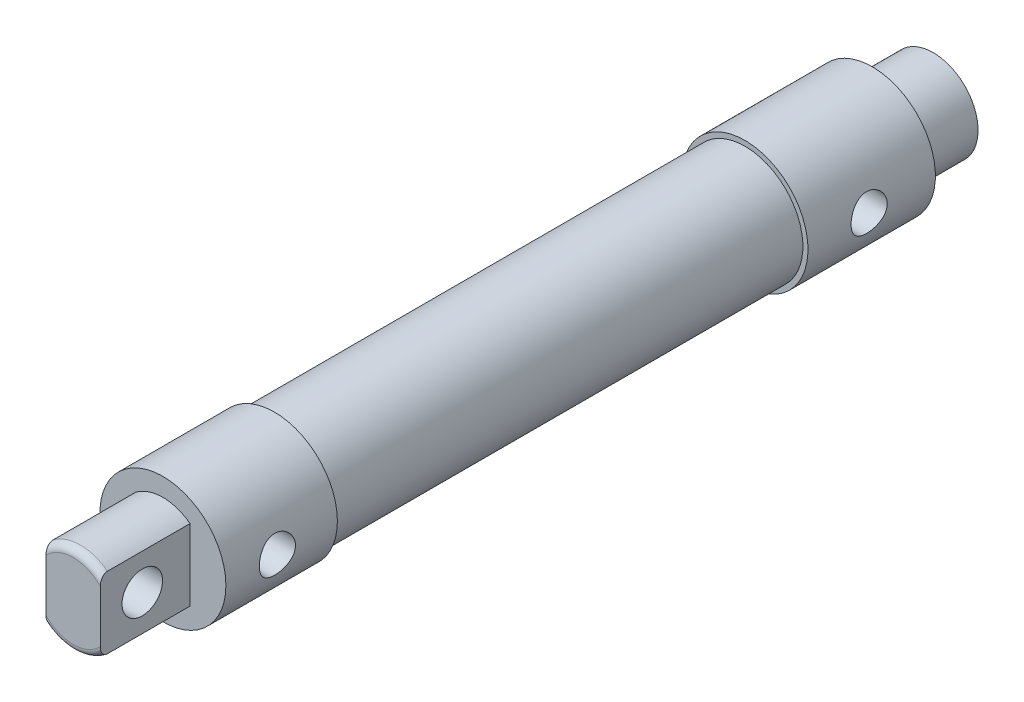
ISO-10303-21;
HEADER;
FILE_DESCRIPTION(('STEP AP214'),'2;1');
FILE_NAME('part.step','',(''),(''),'','','');
FILE_SCHEMA(('AUTOMOTIVE_DESIGN { 1 0 10303 214 1 1 1 1 }'));
ENDSEC;
DATA;
#1=APPLICATION_CONTEXT('core data for automotive mechanical design processes');
#2=APPLICATION_PROTOCOL_DEFINITION('international standard','automotive_design',2000,#1);
#3=PRODUCT_CONTEXT('',#1,'mechanical');
#4=PRODUCT('Part','Part','',(#3));
#5=PRODUCT_RELATED_PRODUCT_CATEGORY('part','',(#4));
#6=PRODUCT_DEFINITION_FORMATION('','',#4);
#7=PRODUCT_DEFINITION_CONTEXT('part definition',#1,'design');
#8=PRODUCT_DEFINITION('design','',#6,#7);
#9=PRODUCT_DEFINITION_SHAPE('','',#8);
#10=(LENGTH_UNIT() NAMED_UNIT(*) SI_UNIT(.MILLI.,.METRE.));
#11=(NAMED_UNIT(*) PLANE_ANGLE_UNIT() SI_UNIT($,.RADIAN.));
#12=(NAMED_UNIT(*) SI_UNIT($,.STERADIAN.) SOLID_ANGLE_UNIT());
#13=UNCERTAINTY_MEASURE_WITH_UNIT(LENGTH_MEASURE(1.E-05),#10,'distance_accuracy_value','');
#14=(GEOMETRIC_REPRESENTATION_CONTEXT(3) GLOBAL_UNCERTAINTY_ASSIGNED_CONTEXT((#13)) GLOBAL_UNIT_ASSIGNED_CONTEXT((#10,
#11,#12)) REPRESENTATION_CONTEXT('',''));
#15=CARTESIAN_POINT('',(0.,0.,0.));
#16=DIRECTION('',(0.,0.,1.));
#17=DIRECTION('',(1.,0.,0.));
#18=AXIS2_PLACEMENT_3D('',#15,#16,#17);
#19=CARTESIAN_POINT('',(0.,0.,102.108));
#20=DIRECTION('',(0.,0.,-1.));
#21=DIRECTION('',(-1.,0.,0.));
#22=AXIS2_PLACEMENT_3D('',#19,#20,#21);
#23=CYLINDRICAL_SURFACE('',#22,11.049);
#24=CARTESIAN_POINT('',(0.,0.,102.108));
#25=DIRECTION('',(0.,0.,1.));
#26=DIRECTION('',(1.,0.,0.));
#27=AXIS2_PLACEMENT_3D('',#24,#25,#26);
#28=CIRCLE('',#27,11.049);
#29=CARTESIAN_POINT('',(11.049,0.,102.108));
#30=VERTEX_POINT('',#29);
#31=EDGE_CURVE('E215',#30,#30,#28,.T.);
#32=ORIENTED_EDGE('',*,*,#31,.F.);
#33=EDGE_LOOP('',(#32));
#34=FACE_BOUND('',#33,.T.);
#35=CARTESIAN_POINT('',(0.,0.,82.55));
#36=DIRECTION('',(0.,0.,1.));
#37=DIRECTION('',(1.,0.,0.));
#38=AXIS2_PLACEMENT_3D('',#35,#36,#37);
#39=CIRCLE('',#38,11.049);
#40=CARTESIAN_POINT('',(11.049,0.,82.55));
#41=VERTEX_POINT('',#40);
#42=EDGE_CURVE('E216',#41,#41,#39,.T.);
#43=ORIENTED_EDGE('',*,*,#42,.T.);
#44=EDGE_LOOP('',(#43));
#45=FACE_BOUND('',#44,.T.);
#46=CARTESIAN_POINT('',(10.5829946612478,-3.175,93.0760778464226));
#47=CARTESIAN_POINT('',(10.5829970378921,-3.17499696173694,93.2504210160346));
#48=CARTESIAN_POINT('',(10.5873499628536,-3.16059101598809,93.4247947914254));
#49=CARTESIAN_POINT('',(10.6042287733974,-3.10348071440142,93.7684686648293));
#50=CARTESIAN_POINT('',(10.6167579154399,-3.06076508315063,93.9377667131465));
#51=CARTESIAN_POINT('',(10.6484555361327,-2.94858604276688,94.266265950174));
#52=CARTESIAN_POINT('',(10.6676136440502,-2.87916439519901,94.4254824534469));
#53=CARTESIAN_POINT('',(10.7103968556723,-2.71567886194747,94.7300428356047));
#54=CARTESIAN_POINT('',(10.7340225055439,-2.62161196278527,94.8753850150505));
#55=CARTESIAN_POINT('',(10.7838478929209,-2.40858326173655,95.1522908243156));
#56=CARTESIAN_POINT('',(10.8100989589948,-2.28903221307923,95.2833920018629));
#57=CARTESIAN_POINT('',(10.8617771284488,-2.02969339145336,95.5239875474528));
#58=CARTESIAN_POINT('',(10.8872041340175,-1.88990322690515,95.63347935838));
#59=CARTESIAN_POINT('',(10.9349482869144,-1.59079703436564,95.8297248552312));
#60=CARTESIAN_POINT('',(10.9571978703645,-1.43116293599986,95.9160116284078));
#61=CARTESIAN_POINT('',(10.9954868205641,-1.09890403668004,96.0603402425021));
#62=CARTESIAN_POINT('',(11.0115274108589,-0.926281803186664,96.1183876488545));
#63=CARTESIAN_POINT('',(11.0352279538983,-0.577780737066135,96.2030726139401));
#64=CARTESIAN_POINT('',(11.0430978601515,-0.402107999548981,96.2304985007207));
#65=CARTESIAN_POINT('',(11.0503076095615,-0.0484902253797742,96.2556497122282));
#66=CARTESIAN_POINT('',(11.0496491013871,0.129454365444954,96.2533807774033));
#67=CARTESIAN_POINT('',(11.0400267625263,0.477051272742408,96.2197461231162));
#68=CARTESIAN_POINT('',(11.0313063870296,0.646793905386179,96.1892332895884));
#69=CARTESIAN_POINT('',(11.0068326238017,0.978639250638321,96.1013641482073));
#70=CARTESIAN_POINT('',(10.991078806017,1.14074149541176,96.0440061989228));
#71=CARTESIAN_POINT('',(10.9539621303433,1.4547904040677,95.9034681087909));
#72=CARTESIAN_POINT('',(10.9325393858836,1.60660549873712,95.8200104285103));
#73=CARTESIAN_POINT('',(10.8863714985496,1.89435605989024,95.6298587495398));
#74=CARTESIAN_POINT('',(10.8616256211488,2.03028800319434,95.5231596104371));
#75=CARTESIAN_POINT('',(10.8104367437012,2.28750533131605,95.2850886155363));
#76=CARTESIAN_POINT('',(10.7839646808932,2.4080998224991,95.1529756044689));
#77=CARTESIAN_POINT('',(10.733084389821,2.62560689303648,94.8701356166965));
#78=CARTESIAN_POINT('',(10.7086763331534,2.72251750463204,94.7194070948998));
#79=CARTESIAN_POINT('',(10.6645569111701,2.89054812362863,94.4019229266747));
#80=CARTESIAN_POINT('',(10.6448854814472,2.96145130546496,94.2350465742272));
#81=CARTESIAN_POINT('',(10.6129476152519,3.07395555813914,93.8910300905357));
#82=CARTESIAN_POINT('',(10.6006789953196,3.11556526969433,93.7138930026082));
#83=CARTESIAN_POINT('',(10.585409663935,3.16704977828252,93.360914762678));
#84=CARTESIAN_POINT('',(10.5821046142205,3.17796715559108,93.185238699667));
#85=CARTESIAN_POINT('',(10.5842985066283,3.17065339734403,92.8345648988625));
#86=CARTESIAN_POINT('',(10.5897963357224,3.15242594683497,92.659567078117));
#87=CARTESIAN_POINT('',(10.6086796202177,3.08826497319619,92.3194335876821));
#88=CARTESIAN_POINT('',(10.6218788212302,3.04298510170739,92.1541632424752));
#89=CARTESIAN_POINT('',(10.654488955992,2.92675343849825,91.8335706419406));
#90=CARTESIAN_POINT('',(10.6739007932801,2.85579791242604,91.6782498375766));
#91=CARTESIAN_POINT('',(10.7173525725105,2.68819763195385,91.3776772532887));
#92=CARTESIAN_POINT('',(10.7414960228918,2.59095536802797,91.2327739732972));
#93=CARTESIAN_POINT('',(10.7914602367789,2.37426353068632,90.9609601536623));
#94=CARTESIAN_POINT('',(10.8172813672868,2.25480908751678,90.8340535703535));
#95=CARTESIAN_POINT('',(10.8687608358398,1.99221286364236,90.5973670912839));
#96=CARTESIAN_POINT('',(10.8943833784092,1.84840048120929,90.4883217183711));
#97=CARTESIAN_POINT('',(10.9416824947104,1.54391896032718,90.2959043170114));
#98=CARTESIAN_POINT('',(10.963359273833,1.38325069997259,90.2125309520897));
#99=CARTESIAN_POINT('',(11.0001869824692,1.05072587538093,90.0746217473224));
#100=CARTESIAN_POINT('',(11.0153871097535,0.8789655035982,90.0198677607017));
#101=CARTESIAN_POINT('',(11.0377661850788,0.528171227762893,89.9401585545153));
#102=CARTESIAN_POINT('',(11.0449472223555,0.349139230810347,89.9151955732998));
#103=CARTESIAN_POINT('',(11.0503629040812,-0.00430043148248762,89.8963271602359));
#104=CARTESIAN_POINT('',(11.0489056996126,-0.178647014664036,89.9013520194536));
#105=CARTESIAN_POINT('',(11.0379233962819,-0.523908669717691,89.9397882629655));
#106=CARTESIAN_POINT('',(11.0283986915624,-0.69482390881254,89.9731982604872));
#107=CARTESIAN_POINT('',(11.0024294098578,-1.0268668171994,90.0668151441214));
#108=CARTESIAN_POINT('',(10.9860488399852,-1.18806963267255,90.1267744555124));
#109=CARTESIAN_POINT('',(10.9480678507565,-1.49821572280081,90.2715676330534));
#110=CARTESIAN_POINT('',(10.9264666173167,-1.64715708060556,90.3564053790612));
#111=CARTESIAN_POINT('',(10.8795235460163,-1.93340384841198,90.5515049284692));
#112=CARTESIAN_POINT('',(10.8540889319086,-2.07022613928248,90.6624530931705));
#113=CARTESIAN_POINT('',(10.8026716112853,-2.32367039959812,90.9053626023441));
#114=CARTESIAN_POINT('',(10.7766887543745,-2.44028674310765,91.0373297795669));
#115=CARTESIAN_POINT('',(10.7263080053237,-2.65311527076294,91.3227581932267));
#116=CARTESIAN_POINT('',(10.7019708346248,-2.7487006048838,91.4766986591247));
#117=CARTESIAN_POINT('',(10.6585601925368,-2.91251111919759,91.7991430987811));
#118=CARTESIAN_POINT('',(10.6394838228281,-2.98075137397164,91.9676389860896));
#119=CARTESIAN_POINT('',(10.6109457090473,-3.08067604297106,92.2918605638783));
#120=CARTESIAN_POINT('',(10.6005573203454,-3.11595595609863,92.4464045642196));
#121=CARTESIAN_POINT('',(10.5865812685406,-3.16311741659185,92.7593169877032));
#122=CARTESIAN_POINT('',(10.5829925020353,-3.17500276030191,92.9176847861173));
#123=CARTESIAN_POINT('',(10.5829946612478,-3.175,93.0760778464226));
#124=B_SPLINE_CURVE_WITH_KNOTS('',3,(#46,#47,#48,#49,#50,#51,#52,#53,#54,#55,#56,#57,#58,#59,
#60,#61,#62,#63,#64,#65,#66,#67,#68,#69,#70,#71,#72,#73,#74,#75,#76,#77,#78,#79,#80,#81,#82,#83,
#84,#85,#86,#87,#88,#89,#90,#91,#92,#93,#94,#95,#96,#97,#98,#99,#100,#101,#102,#103,#104,#105,
#106,#107,#108,#109,#110,#111,#112,#113,#114,#115,#116,#117,#118,#119,#120,#121,#122,#123),
.UNSPECIFIED.,.T.,.F.,(4,2,2,2,2,2,2,2,2,2,2,2,2,2,2,2,2,2,2,2,2,2,2,2,2,2,2,2,2,2,2,2,2,2,2,2,
2,2,4),(0.,0.522445971515646,1.04510015223567,1.56694033248867,2.08884435013764,
2.62446334981218,3.16014569329022,3.70591356848465,4.25157383973313,4.78283705764741,
5.31399757604563,5.82962412489643,6.34528220559616,6.86662167203276,7.38807656264306,
7.92803521591125,8.46803871603087,9.01244709372958,9.55669481951292,10.0822178130475,
10.6076743651684,11.1209208176782,11.6342419484683,12.1603874377864,12.6866484144843,
13.230914757694,13.7751527618185,14.3151795683734,14.8550656473995,15.375811108637,
15.8965311300157,16.4124944283516,16.9285382353606,17.4600631929064,17.9917359057943,
18.5375828018549,19.0831283723763,19.5578544443061,20.0325034738991),.UNSPECIFIED.);
#125=CARTESIAN_POINT('',(10.5829946612478,-3.175,93.0760778464226));
#126=VERTEX_POINT('',#125);
#127=EDGE_CURVE('E119',#126,#126,#124,.T.);
#128=ORIENTED_EDGE('',*,*,#127,.T.);
#129=EDGE_LOOP('',(#128));
#130=FACE_BOUND('',#129,.T.);
#131=ADVANCED_FACE('F46',(#34,#45,#130),#23,.T.);
#132=CARTESIAN_POINT('',(0.,0.,91.948));
#133=DIRECTION('',(0.,0.,-1.));
#134=DIRECTION('',(-1.,0.,0.));
#135=AXIS2_PLACEMENT_3D('',#132,#133,#134);
#136=CYLINDRICAL_SURFACE('',#135,3.175);
#137=CARTESIAN_POINT('',(0.,0.,82.55));
#138=DIRECTION('',(0.,0.,1.));
#139=DIRECTION('',(1.,0.,0.));
#140=AXIS2_PLACEMENT_3D('',#137,#138,#139);
#141=CIRCLE('',#140,3.175);
#142=CARTESIAN_POINT('',(3.175,0.,82.55));
#143=VERTEX_POINT('',#142);
#144=EDGE_CURVE('E51',#143,#143,#141,.T.);
#145=ORIENTED_EDGE('',*,*,#144,.F.);
#146=EDGE_LOOP('',(#145));
#147=FACE_BOUND('',#146,.T.);
#148=CARTESIAN_POINT('',(0.,0.,93.0760778464226));
#149=DIRECTION('',(-0.707106781186548,0.,-0.707106781186547));
#150=DIRECTION('',(-0.707106781186548,0.,0.707106781186547));
#151=AXIS2_PLACEMENT_3D('',#148,#149,#150);
#152=ELLIPSE('',#151,4.49012806053458,3.175);
#153=CARTESIAN_POINT('',(1.12807784642254,-2.96783850174006,91.948));
#154=VERTEX_POINT('',#153);
#155=CARTESIAN_POINT('',(1.12807784642255,2.96783850174005,91.948));
#156=VERTEX_POINT('',#155);
#157=EDGE_CURVE('E123',#154,#156,#152,.F.);
#158=ORIENTED_EDGE('',*,*,#157,.T.);
#159=CARTESIAN_POINT('',(0.,0.,91.948));
#160=DIRECTION('',(0.,0.,-1.));
#161=DIRECTION('',(-1.,0.,0.));
#162=AXIS2_PLACEMENT_3D('',#159,#160,#161);
#163=CIRCLE('',#162,3.175);
#164=EDGE_CURVE('E128',#154,#156,#163,.T.);
#165=ORIENTED_EDGE('',*,*,#164,.F.);
#166=EDGE_LOOP('',(#158,#165));
#167=FACE_BOUND('',#166,.T.);
#168=ADVANCED_FACE('F149',(#147,#167),#136,.F.);
#169=CARTESIAN_POINT('',(0.,0.,91.948));
#170=DIRECTION('',(0.,0.,-1.));
#171=DIRECTION('',(-1.,0.,0.));
#172=AXIS2_PLACEMENT_3D('',#169,#170,#171);
#173=PLANE('',#172);
#174=DIRECTION('',(0.,1.,0.));
#175=VECTOR('',#174,1.);
#176=CARTESIAN_POINT('',(0.,0.,91.948));
#177=LINE('',#176,#175);
#178=CARTESIAN_POINT('',(0.,-2.96783850174005,91.948));
#179=VERTEX_POINT('',#178);
#180=CARTESIAN_POINT('',(0.,2.96783850174005,91.948));
#181=VERTEX_POINT('',#180);
#182=EDGE_CURVE('E118',#179,#181,#177,.T.);
#183=ORIENTED_EDGE('',*,*,#182,.F.);
#184=DIRECTION('',(-1.,0.,0.));
#185=VECTOR('',#184,1.);
#186=CARTESIAN_POINT('',(11.05,-2.96783850174005,91.948));
#187=LINE('',#186,#185);
#188=EDGE_CURVE('E63',#154,#179,#187,.T.);
#189=ORIENTED_EDGE('',*,*,#188,.F.);
#190=ORIENTED_EDGE('',*,*,#164,.T.);
#191=DIRECTION('',(-1.,0.,0.));
#192=VECTOR('',#191,1.);
#193=CARTESIAN_POINT('',(11.05,2.96783850174006,91.948));
#194=LINE('',#193,#192);
#195=EDGE_CURVE('E114',#181,#156,#194,.F.);
#196=ORIENTED_EDGE('',*,*,#195,.F.);
#197=EDGE_LOOP('',(#183,#189,#190,#196));
#198=FACE_BOUND('',#197,.T.);
#199=ADVANCED_FACE('F126',(#198),#173,.T.);
#200=CARTESIAN_POINT('',(0.,0.,102.108));
#201=DIRECTION('',(0.,0.,1.));
#202=DIRECTION('',(1.,0.,0.));
#203=AXIS2_PLACEMENT_3D('',#200,#201,#202);
#204=PLANE('',#203);
#205=ORIENTED_EDGE('',*,*,#31,.T.);
#206=EDGE_LOOP('',(#205));
#207=FACE_BOUND('',#206,.T.);
#208=DIRECTION('',(0.,-1.,0.));
#209=VECTOR('',#208,1.);
#210=CARTESIAN_POINT('',(-4.7625,-6.27044414296148,102.108));
#211=LINE('',#210,#209);
#212=CARTESIAN_POINT('',(-4.7625,6.27044414296148,102.108));
#213=VERTEX_POINT('',#212);
#214=CARTESIAN_POINT('',(-4.7625,-6.27044414296148,102.108));
#215=VERTEX_POINT('',#214);
#216=EDGE_CURVE('E237',#213,#215,#211,.T.);
#217=ORIENTED_EDGE('',*,*,#216,.F.);
#218=CARTESIAN_POINT('',(0.,0.,102.108));
#219=DIRECTION('',(0.,0.,1.));
#220=DIRECTION('',(1.,0.,0.));
#221=AXIS2_PLACEMENT_3D('',#218,#219,#220);
#222=CIRCLE('',#221,7.874);
#223=CARTESIAN_POINT('',(4.7625,6.27044414296148,102.108));
#224=VERTEX_POINT('',#223);
#225=EDGE_CURVE('E240',#224,#213,#222,.T.);
#226=ORIENTED_EDGE('',*,*,#225,.F.);
#227=DIRECTION('',(0.,1.,0.));
#228=VECTOR('',#227,1.);
#229=CARTESIAN_POINT('',(4.7625,-6.27044414296148,102.108));
#230=LINE('',#229,#228);
#231=CARTESIAN_POINT('',(4.7625,-6.27044414296148,102.108));
#232=VERTEX_POINT('',#231);
#233=EDGE_CURVE('E230',#232,#224,#230,.T.);
#234=ORIENTED_EDGE('',*,*,#233,.F.);
#235=CARTESIAN_POINT('',(0.,0.,102.108));
#236=DIRECTION('',(0.,0.,1.));
#237=DIRECTION('',(1.,0.,0.));
#238=AXIS2_PLACEMENT_3D('',#235,#236,#237);
#239=CIRCLE('',#238,7.874);
#240=EDGE_CURVE('E234',#215,#232,#239,.T.);
#241=ORIENTED_EDGE('',*,*,#240,.F.);
#242=EDGE_LOOP('',(#217,#226,#234,#241));
#243=FACE_BOUND('',#242,.T.);
#244=ADVANCED_FACE('F259',(#207,#243),#204,.T.);
#245=CARTESIAN_POINT('',(0.,0.,82.55));
#246=DIRECTION('',(0.,0.,1.));
#247=DIRECTION('',(1.,0.,0.));
#248=AXIS2_PLACEMENT_3D('',#245,#246,#247);
#249=PLANE('',#248);
#250=ORIENTED_EDGE('',*,*,#144,.T.);
#251=EDGE_LOOP('',(#250));
#252=FACE_BOUND('',#251,.T.);
#253=ORIENTED_EDGE('',*,*,#42,.F.);
#254=EDGE_LOOP('',(#253));
#255=FACE_BOUND('',#254,.T.);
#256=ADVANCED_FACE('F160',(#252,#255),#249,.F.);
#257=CARTESIAN_POINT('',(0.,0.,117.856));
#258=DIRECTION('',(0.,0.,-1.));
#259=DIRECTION('',(-1.,0.,0.));
#260=AXIS2_PLACEMENT_3D('',#257,#258,#259);
#261=CYLINDRICAL_SURFACE('',#260,7.874);
#262=DIRECTION('',(0.,0.,-1.));
#263=VECTOR('',#262,1.);
#264=CARTESIAN_POINT('',(-4.7625,6.27044414296148,117.856));
#265=LINE('',#264,#263);
#266=CARTESIAN_POINT('',(-4.7625,6.27044414296148,116.586));
#267=VERTEX_POINT('',#266);
#268=EDGE_CURVE('E219',#267,#213,#265,.T.);
#269=ORIENTED_EDGE('',*,*,#268,.F.);
#270=CARTESIAN_POINT('',(0.,0.,116.586));
#271=DIRECTION('',(0.,0.,1.));
#272=DIRECTION('',(1.,0.,0.));
#273=AXIS2_PLACEMENT_3D('',#270,#271,#272);
#274=CIRCLE('',#273,7.874);
#275=CARTESIAN_POINT('',(4.7625,6.27044414296148,116.586));
#276=VERTEX_POINT('',#275);
#277=EDGE_CURVE('E284',#267,#276,#274,.F.);
#278=ORIENTED_EDGE('',*,*,#277,.T.);
#279=DIRECTION('',(0.,0.,-1.));
#280=VECTOR('',#279,1.);
#281=CARTESIAN_POINT('',(4.7625,6.27044414296148,117.856));
#282=LINE('',#281,#280);
#283=EDGE_CURVE('E227',#276,#224,#282,.T.);
#284=ORIENTED_EDGE('',*,*,#283,.T.);
#285=ORIENTED_EDGE('',*,*,#225,.T.);
#286=EDGE_LOOP('',(#269,#278,#284,#285));
#287=FACE_BOUND('',#286,.T.);
#288=ADVANCED_FACE('F201',(#287),#261,.T.);
#289=CARTESIAN_POINT('',(-4.7625,-6.27044414296148,117.856));
#290=DIRECTION('',(1.,0.,0.));
#291=DIRECTION('',(0.,1.,0.));
#292=AXIS2_PLACEMENT_3D('',#289,#290,#291);
#293=PLANE('',#292);
#294=CARTESIAN_POINT('',(-4.7625,0.,110.49));
#295=DIRECTION('',(1.,0.,0.));
#296=DIRECTION('',(0.,1.,0.));
#297=AXIS2_PLACEMENT_3D('',#294,#295,#296);
#298=CIRCLE('',#297,3.556);
#299=CARTESIAN_POINT('',(-4.7625,3.556,110.49));
#300=VERTEX_POINT('',#299);
#301=EDGE_CURVE('E243',#300,#300,#298,.F.);
#302=ORIENTED_EDGE('',*,*,#301,.F.);
#303=EDGE_LOOP('',(#302));
#304=FACE_BOUND('',#303,.T.);
#305=DIRECTION('',(0.,-1.,0.));
#306=VECTOR('',#305,1.);
#307=CARTESIAN_POINT('',(-4.7625,-6.27044414296148,117.856));
#308=LINE('',#307,#306);
#309=CARTESIAN_POINT('',(-4.7625,4.57508576422344,117.856));
#310=VERTEX_POINT('',#309);
#311=CARTESIAN_POINT('',(-4.7625,-4.57508576422344,117.856));
#312=VERTEX_POINT('',#311);
#313=EDGE_CURVE('E233',#310,#312,#308,.T.);
#314=ORIENTED_EDGE('',*,*,#313,.F.);
#315=CARTESIAN_POINT('',(-4.7625,4.57508576422344,117.856));
#316=CARTESIAN_POINT('',(-4.7625,4.70491371485058,117.855988992306));
#317=CARTESIAN_POINT('',(-4.7625,4.83558278945041,117.84641170347));
#318=CARTESIAN_POINT('',(-4.7625,5.09465420787404,117.804901270244));
#319=CARTESIAN_POINT('',(-4.7625,5.22301707247969,117.772728857364));
#320=CARTESIAN_POINT('',(-4.7625,5.42870338399686,117.697882839221));
#321=CARTESIAN_POINT('',(-4.7625,5.50862070615666,117.662427605347));
#322=CARTESIAN_POINT('',(-4.7625,5.66172310725953,117.579556838602));
#323=CARTESIAN_POINT('',(-4.7625,5.73493413756744,117.532190319702));
#324=CARTESIAN_POINT('',(-4.7625,5.85954621136902,117.43471115017));
#325=CARTESIAN_POINT('',(-4.7625,5.91250696068593,117.386601100032));
#326=CARTESIAN_POINT('',(-4.7625,6.00991201638405,117.282266864641));
#327=CARTESIAN_POINT('',(-4.7625,6.05435186214026,117.226038456345));
#328=CARTESIAN_POINT('',(-4.7625,6.13268330527644,117.105874884677));
#329=CARTESIAN_POINT('',(-4.7625,6.16647767328858,117.041875685665));
#330=CARTESIAN_POINT('',(-4.7625,6.22061826265151,116.908469254315));
#331=CARTESIAN_POINT('',(-4.7625,6.24099787353804,116.839075933595));
#332=CARTESIAN_POINT('',(-4.7625,6.25939312554719,116.738328586812));
#333=CARTESIAN_POINT('',(-4.7625,6.26353112778692,116.708002020549));
#334=CARTESIAN_POINT('',(-4.7625,6.26905575751436,116.647123988509));
#335=CARTESIAN_POINT('',(-4.7625,6.27044458262064,116.616572721978));
#336=CARTESIAN_POINT('',(-4.7625,6.27044414296148,116.586));
#337=B_SPLINE_CURVE_WITH_KNOTS('',3,(#315,#316,#317,#318,#319,#320,#321,#322,#323,#324,#325,
#326,#327,#328,#329,#330,#331,#332,#333,#334,#335,#336),.UNSPECIFIED.,.F.,.F.,(4,2,2,2,2,2,2,2,
2,2,4),(0.,0.39051208259768,0.785223048386074,1.04660172879821,1.30692197058371,
1.52073252531684,1.7346547043959,1.95047758121078,2.16576121964784,2.25747938820261,
2.34912421005433),.UNSPECIFIED.);
#338=EDGE_CURVE('E169',#310,#267,#337,.T.);
#339=ORIENTED_EDGE('',*,*,#338,.T.);
#340=ORIENTED_EDGE('',*,*,#268,.T.);
#341=ORIENTED_EDGE('',*,*,#216,.T.);
#342=DIRECTION('',(0.,0.,-1.));
#343=VECTOR('',#342,1.);
#344=CARTESIAN_POINT('',(-4.7625,-6.27044414296148,117.856));
#345=LINE('',#344,#343);
#346=CARTESIAN_POINT('',(-4.7625,-6.27044414296148,116.586));
#347=VERTEX_POINT('',#346);
#348=EDGE_CURVE('E223',#347,#215,#345,.T.);
#349=ORIENTED_EDGE('',*,*,#348,.F.);
#350=CARTESIAN_POINT('',(-4.7625,-6.27044414296148,116.586));
#351=CARTESIAN_POINT('',(-4.7625,-6.27044695744104,116.616318737493));
#352=CARTESIAN_POINT('',(-4.7625,-6.26907969386893,116.646620938918));
#353=CARTESIAN_POINT('',(-4.7625,-6.26364600379126,116.706969671006));
#354=CARTESIAN_POINT('',(-4.7625,-6.25958072650013,116.737016305011));
#355=CARTESIAN_POINT('',(-4.7625,-6.24346537985301,116.826103039148));
#356=CARTESIAN_POINT('',(-4.7625,-6.22749460557059,116.884476323768));
#357=CARTESIAN_POINT('',(-4.7625,-6.18599695256506,116.997565139999));
#358=CARTESIAN_POINT('',(-4.7625,-6.16048225576697,117.052285230088));
#359=CARTESIAN_POINT('',(-4.7625,-6.10112984915438,117.15705512157));
#360=CARTESIAN_POINT('',(-4.7625,-6.06728241065118,117.207099368899));
#361=CARTESIAN_POINT('',(-4.7625,-5.99039711728846,117.304581778947));
#362=CARTESIAN_POINT('',(-4.7625,-5.9469247650016,117.351675051199));
#363=CARTESIAN_POINT('',(-4.7625,-5.85384044814121,117.439249704828));
#364=CARTESIAN_POINT('',(-4.7625,-5.80422853679333,117.479731143517));
#365=CARTESIAN_POINT('',(-4.7625,-5.67534049300729,117.571859726782));
#366=CARTESIAN_POINT('',(-4.7625,-5.59323792773678,117.619567571663));
#367=CARTESIAN_POINT('',(-4.7625,-5.42216260650941,117.701174178103));
#368=CARTESIAN_POINT('',(-4.7625,-5.33316043671504,117.735009459685));
#369=CARTESIAN_POINT('',(-4.7625,-5.13378043928996,117.795050891071));
#370=CARTESIAN_POINT('',(-4.7625,-5.02259523817668,117.81851969187));
#371=CARTESIAN_POINT('',(-4.7625,-4.79915137908822,117.848894386153));
#372=CARTESIAN_POINT('',(-4.7625,-4.68691720505675,117.855976060827));
#373=CARTESIAN_POINT('',(-4.7625,-4.57508576422344,117.856));
#374=B_SPLINE_CURVE_WITH_KNOTS('',3,(#350,#351,#352,#353,#354,#355,#356,#357,#358,#359,#360,
#361,#362,#363,#364,#365,#366,#367,#368,#369,#370,#371,#372,#373),.UNSPECIFIED.,.F.,.F.,(4,2,2,
2,2,2,2,2,2,2,2,4),(0.,0.0908934298733058,0.181748168669605,0.362315077107739,0.542652290896589,
0.723201059897704,0.91475718163734,1.10631164283679,1.38961771540344,1.67420608669171,
2.01378321177532,2.34970053458326),.UNSPECIFIED.);
#375=EDGE_CURVE('E204',#347,#312,#374,.T.);
#376=ORIENTED_EDGE('',*,*,#375,.T.);
#377=EDGE_LOOP('',(#314,#339,#340,#341,#349,#376));
#378=FACE_BOUND('',#377,.T.);
#379=ADVANCED_FACE('F196',(#304,#378),#293,.F.);
#380=CARTESIAN_POINT('',(0.,0.,117.856));
#381=DIRECTION('',(0.,0.,-1.));
#382=DIRECTION('',(-1.,0.,0.));
#383=AXIS2_PLACEMENT_3D('',#380,#381,#382);
#384=CYLINDRICAL_SURFACE('',#383,7.874);
#385=DIRECTION('',(0.,0.,-1.));
#386=VECTOR('',#385,1.);
#387=CARTESIAN_POINT('',(4.7625,-6.27044414296148,117.856));
#388=LINE('',#387,#386);
#389=CARTESIAN_POINT('',(4.7625,-6.27044414296148,116.586));
#390=VERTEX_POINT('',#389);
#391=EDGE_CURVE('E225',#390,#232,#388,.T.);
#392=ORIENTED_EDGE('',*,*,#391,.F.);
#393=CARTESIAN_POINT('',(0.,0.,116.586));
#394=DIRECTION('',(0.,0.,1.));
#395=DIRECTION('',(1.,0.,0.));
#396=AXIS2_PLACEMENT_3D('',#393,#394,#395);
#397=CIRCLE('',#396,7.874);
#398=EDGE_CURVE('E12',#390,#347,#397,.F.);
#399=ORIENTED_EDGE('',*,*,#398,.T.);
#400=ORIENTED_EDGE('',*,*,#348,.T.);
#401=ORIENTED_EDGE('',*,*,#240,.T.);
#402=EDGE_LOOP('',(#392,#399,#400,#401));
#403=FACE_BOUND('',#402,.T.);
#404=ADVANCED_FACE('F191',(#403),#384,.T.);
#405=CARTESIAN_POINT('',(4.7625,-6.27044414296148,117.856));
#406=DIRECTION('',(-1.,0.,0.));
#407=DIRECTION('',(0.,0.,1.));
#408=AXIS2_PLACEMENT_3D('',#405,#406,#407);
#409=PLANE('',#408);
#410=CARTESIAN_POINT('',(4.7625,0.,110.49));
#411=DIRECTION('',(1.,0.,0.));
#412=DIRECTION('',(0.,0.,-1.));
#413=AXIS2_PLACEMENT_3D('',#410,#411,#412);
#414=CIRCLE('',#413,3.556);
#415=CARTESIAN_POINT('',(4.7625,0.,106.934));
#416=VERTEX_POINT('',#415);
#417=EDGE_CURVE('E249',#416,#416,#414,.T.);
#418=ORIENTED_EDGE('',*,*,#417,.F.);
#419=EDGE_LOOP('',(#418));
#420=FACE_BOUND('',#419,.T.);
#421=ORIENTED_EDGE('',*,*,#283,.F.);
#422=CARTESIAN_POINT('',(4.7625,6.27044414296148,116.586));
#423=CARTESIAN_POINT('',(4.7625,6.27044695744104,116.616318737493));
#424=CARTESIAN_POINT('',(4.7625,6.26907969386893,116.646620938918));
#425=CARTESIAN_POINT('',(4.7625,6.26364600379127,116.706969671006));
#426=CARTESIAN_POINT('',(4.7625,6.25958072650013,116.737016305011));
#427=CARTESIAN_POINT('',(4.7625,6.24346537985301,116.826103039148));
#428=CARTESIAN_POINT('',(4.7625,6.22749460557059,116.884476323768));
#429=CARTESIAN_POINT('',(4.7625,6.18599695256506,116.997565139999));
#430=CARTESIAN_POINT('',(4.7625,6.16048225576698,117.052285230088));
#431=CARTESIAN_POINT('',(4.7625,6.1011298491544,117.15705512157));
#432=CARTESIAN_POINT('',(4.7625,6.06728241065119,117.207099368899));
#433=CARTESIAN_POINT('',(4.7625,5.99039711728846,117.304581778947));
#434=CARTESIAN_POINT('',(4.7625,5.9469247650016,117.351675051199));
#435=CARTESIAN_POINT('',(4.7625,5.85384044814121,117.439249704828));
#436=CARTESIAN_POINT('',(4.7625,5.80422853679333,117.479731143517));
#437=CARTESIAN_POINT('',(4.7625,5.6753404930073,117.571859726782));
#438=CARTESIAN_POINT('',(4.7625,5.59323792773679,117.619567571663));
#439=CARTESIAN_POINT('',(4.7625,5.42216260650943,117.701174178103));
#440=CARTESIAN_POINT('',(4.7625,5.33316043671506,117.735009459685));
#441=CARTESIAN_POINT('',(4.7625,5.13378043928998,117.795050891071));
#442=CARTESIAN_POINT('',(4.7625,5.02259523817669,117.81851969187));
#443=CARTESIAN_POINT('',(4.7625,4.79915137908822,117.848894386153));
#444=CARTESIAN_POINT('',(4.7625,4.68691720505676,117.855976060827));
#445=CARTESIAN_POINT('',(4.7625,4.57508576422344,117.856));
#446=B_SPLINE_CURVE_WITH_KNOTS('',3,(#422,#423,#424,#425,#426,#427,#428,#429,#430,#431,#432,
#433,#434,#435,#436,#437,#438,#439,#440,#441,#442,#443,#444,#445),.UNSPECIFIED.,.F.,.F.,(4,2,2,
2,2,2,2,2,2,2,2,4),(0.,0.0908934298733058,0.181748168669605,0.362315077107739,0.542652290896557,
0.723201059897703,0.914757181637344,1.10631164283678,1.38961771540342,1.67420608669169,
2.01378321177531,2.34970053458325),.UNSPECIFIED.);
#447=CARTESIAN_POINT('',(4.7625,4.57508576422344,117.856));
#448=VERTEX_POINT('',#447);
#449=EDGE_CURVE('E56',#276,#448,#446,.T.);
#450=ORIENTED_EDGE('',*,*,#449,.T.);
#451=DIRECTION('',(0.,1.,0.));
#452=VECTOR('',#451,1.);
#453=CARTESIAN_POINT('',(4.7625,-6.27044414296148,117.856));
#454=LINE('',#453,#452);
#455=CARTESIAN_POINT('',(4.7625,-4.57508576422344,117.856));
#456=VERTEX_POINT('',#455);
#457=EDGE_CURVE('E229',#456,#448,#454,.T.);
#458=ORIENTED_EDGE('',*,*,#457,.F.);
#459=CARTESIAN_POINT('',(4.7625,-4.57508576422344,117.856));
#460=CARTESIAN_POINT('',(4.7625,-4.70491371485058,117.855988992306));
#461=CARTESIAN_POINT('',(4.7625,-4.83558278945041,117.84641170347));
#462=CARTESIAN_POINT('',(4.7625,-5.09465420787404,117.804901270244));
#463=CARTESIAN_POINT('',(4.7625,-5.22301707247968,117.772728857364));
#464=CARTESIAN_POINT('',(4.7625,-5.42870338399685,117.697882839221));
#465=CARTESIAN_POINT('',(4.7625,-5.50862070615666,117.662427605347));
#466=CARTESIAN_POINT('',(4.7625,-5.66172310725953,117.579556838602));
#467=CARTESIAN_POINT('',(4.7625,-5.73493413756743,117.532190319702));
#468=CARTESIAN_POINT('',(4.7625,-5.85954621136902,117.43471115017));
#469=CARTESIAN_POINT('',(4.7625,-5.91250696068594,117.386601100032));
#470=CARTESIAN_POINT('',(4.7625,-6.00991201638405,117.282266864641));
#471=CARTESIAN_POINT('',(4.7625,-6.05435186214026,117.226038456345));
#472=CARTESIAN_POINT('',(4.7625,-6.13268330527643,117.105874884677));
#473=CARTESIAN_POINT('',(4.7625,-6.16647767328858,117.041875685665));
#474=CARTESIAN_POINT('',(4.7625,-6.22061826265151,116.908469254315));
#475=CARTESIAN_POINT('',(4.7625,-6.24099787353804,116.839075933595));
#476=CARTESIAN_POINT('',(4.7625,-6.25939312554719,116.738328586812));
#477=CARTESIAN_POINT('',(4.7625,-6.26353112778692,116.708002020549));
#478=CARTESIAN_POINT('',(4.7625,-6.26905575751435,116.647123988509));
#479=CARTESIAN_POINT('',(4.7625,-6.27044458262064,116.616572721978));
#480=CARTESIAN_POINT('',(4.7625,-6.27044414296148,116.586));
#481=B_SPLINE_CURVE_WITH_KNOTS('',3,(#459,#460,#461,#462,#463,#464,#465,#466,#467,#468,#469,
#470,#471,#472,#473,#474,#475,#476,#477,#478,#479,#480),.UNSPECIFIED.,.F.,.F.,(4,2,2,2,2,2,2,2,
2,2,4),(0.,0.390512082597678,0.785223048386074,1.04660172879821,1.30692197058371,
1.52073252531686,1.7346547043959,1.95047758121078,2.16576121964783,2.25747938820261,
2.34912421005431),.UNSPECIFIED.);
#482=EDGE_CURVE('E71',#456,#390,#481,.T.);
#483=ORIENTED_EDGE('',*,*,#482,.T.);
#484=ORIENTED_EDGE('',*,*,#391,.T.);
#485=ORIENTED_EDGE('',*,*,#233,.T.);
#486=EDGE_LOOP('',(#421,#450,#458,#483,#484,#485));
#487=FACE_BOUND('',#486,.T.);
#488=ADVANCED_FACE('F185',(#420,#487),#409,.F.);
#489=CARTESIAN_POINT('',(0.,0.,117.856));
#490=DIRECTION('',(0.,0.,1.));
#491=DIRECTION('',(1.,0.,0.));
#492=AXIS2_PLACEMENT_3D('',#489,#490,#491);
#493=PLANE('',#492);
#494=ORIENTED_EDGE('',*,*,#457,.T.);
#495=CARTESIAN_POINT('',(0.,0.,117.856));
#496=DIRECTION('',(0.,0.,1.));
#497=DIRECTION('',(1.,0.,0.));
#498=AXIS2_PLACEMENT_3D('',#495,#496,#497);
#499=CIRCLE('',#498,6.604);
#500=EDGE_CURVE('E209',#448,#310,#499,.T.);
#501=ORIENTED_EDGE('',*,*,#500,.T.);
#502=ORIENTED_EDGE('',*,*,#313,.T.);
#503=CARTESIAN_POINT('',(0.,0.,117.856));
#504=DIRECTION('',(0.,0.,1.));
#505=DIRECTION('',(1.,0.,0.));
#506=AXIS2_PLACEMENT_3D('',#503,#504,#505);
#507=CIRCLE('',#506,6.604);
#508=EDGE_CURVE('E212',#312,#456,#507,.T.);
#509=ORIENTED_EDGE('',*,*,#508,.T.);
#510=EDGE_LOOP('',(#494,#501,#502,#509));
#511=FACE_BOUND('',#510,.T.);
#512=ADVANCED_FACE('F190',(#511),#493,.T.);
#513=CARTESIAN_POINT('',(-11.05,0.,110.49));
#514=DIRECTION('',(1.,0.,0.));
#515=DIRECTION('',(0.,0.,-1.));
#516=AXIS2_PLACEMENT_3D('',#513,#514,#515);
#517=CYLINDRICAL_SURFACE('',#516,3.556);
#518=ORIENTED_EDGE('',*,*,#417,.T.);
#519=EDGE_LOOP('',(#518));
#520=FACE_BOUND('',#519,.T.);
#521=ORIENTED_EDGE('',*,*,#301,.T.);
#522=EDGE_LOOP('',(#521));
#523=FACE_BOUND('',#522,.T.);
#524=ADVANCED_FACE('F165',(#520,#523),#517,.F.);
#525=CARTESIAN_POINT('',(0.,0.,116.586));
#526=DIRECTION('',(0.,0.,1.));
#527=DIRECTION('',(1.,0.,0.));
#528=AXIS2_PLACEMENT_3D('',#525,#526,#527);
#529=TOROIDAL_SURFACE('',#528,6.604,1.27);
#530=ORIENTED_EDGE('',*,*,#449,.F.);
#531=ORIENTED_EDGE('',*,*,#277,.F.);
#532=ORIENTED_EDGE('',*,*,#338,.F.);
#533=ORIENTED_EDGE('',*,*,#500,.F.);
#534=EDGE_LOOP('',(#530,#531,#532,#533));
#535=FACE_BOUND('',#534,.T.);
#536=ADVANCED_FACE('F162',(#535),#529,.T.);
#537=CARTESIAN_POINT('',(0.,0.,116.586));
#538=DIRECTION('',(0.,0.,1.));
#539=DIRECTION('',(1.,0.,0.));
#540=AXIS2_PLACEMENT_3D('',#537,#538,#539);
#541=TOROIDAL_SURFACE('',#540,6.604,1.27);
#542=ORIENTED_EDGE('',*,*,#375,.F.);
#543=ORIENTED_EDGE('',*,*,#398,.F.);
#544=ORIENTED_EDGE('',*,*,#482,.F.);
#545=ORIENTED_EDGE('',*,*,#508,.F.);
#546=EDGE_LOOP('',(#542,#543,#544,#545));
#547=FACE_BOUND('',#546,.T.);
#548=ADVANCED_FACE('F48',(#547),#541,.T.);
#549=CARTESIAN_POINT('',(11.05,0.,93.0760778464226));
#550=DIRECTION('',(-1.,0.,0.));
#551=DIRECTION('',(0.,-1.,0.));
#552=AXIS2_PLACEMENT_3D('',#549,#550,#551);
#553=CYLINDRICAL_SURFACE('',#552,3.175);
#554=ORIENTED_EDGE('',*,*,#188,.T.);
#555=CARTESIAN_POINT('',(0.,0.,93.0760778464226));
#556=DIRECTION('',(1.,0.,0.));
#557=DIRECTION('',(0.,1.,0.));
#558=AXIS2_PLACEMENT_3D('',#555,#556,#557);
#559=CIRCLE('',#558,3.175);
#560=EDGE_CURVE('E109',#181,#179,#559,.T.);
#561=ORIENTED_EDGE('',*,*,#560,.F.);
#562=ORIENTED_EDGE('',*,*,#195,.T.);
#563=ORIENTED_EDGE('',*,*,#157,.F.);
#564=EDGE_LOOP('',(#554,#561,#562,#563));
#565=FACE_BOUND('',#564,.T.);
#566=ORIENTED_EDGE('',*,*,#127,.F.);
#567=EDGE_LOOP('',(#566));
#568=FACE_BOUND('',#567,.T.);
#569=ADVANCED_FACE('F111',(#565,#568),#553,.F.);
#570=CARTESIAN_POINT('',(0.,0.,93.0760778464226));
#571=DIRECTION('',(1.,0.,0.));
#572=DIRECTION('',(0.,1.,0.));
#573=AXIS2_PLACEMENT_3D('',#570,#571,#572);
#574=PLANE('',#573);
#575=ORIENTED_EDGE('',*,*,#182,.T.);
#576=ORIENTED_EDGE('',*,*,#560,.T.);
#577=EDGE_LOOP('',(#575,#576));
#578=FACE_BOUND('',#577,.T.);
#579=ADVANCED_FACE('F121',(#578),#574,.T.);
#580=CLOSED_SHELL('',(#131,#168,#199,#244,#256,#288,#379,#404,#488,#512,#524,#536,#548,#569,#579));
#581=MANIFOLD_SOLID_BREP('B2',#580);
#582=CARTESIAN_POINT('',(0.,0.,-22.352));
#583=DIRECTION('',(0.,0.,1.));
#584=DIRECTION('',(1.,0.,0.));
#585=AXIS2_PLACEMENT_3D('',#582,#583,#584);
#586=CYLINDRICAL_SURFACE('',#585,11.049);
#587=CARTESIAN_POINT('',(0.,0.,-22.352));
#588=DIRECTION('',(0.,0.,-1.));
#589=DIRECTION('',(-1.,0.,0.));
#590=AXIS2_PLACEMENT_3D('',#587,#588,#589);
#591=CIRCLE('',#590,11.049);
#592=CARTESIAN_POINT('',(-11.049,0.,-22.352));
#593=VERTEX_POINT('',#592);
#594=EDGE_CURVE('E461',#593,#593,#591,.T.);
#595=ORIENTED_EDGE('',*,*,#594,.F.);
#596=EDGE_LOOP('',(#595));
#597=FACE_BOUND('',#596,.T.);
#598=CARTESIAN_POINT('',(0.,0.,0.));
#599=DIRECTION('',(0.,0.,-1.));
#600=DIRECTION('',(-1.,0.,0.));
#601=AXIS2_PLACEMENT_3D('',#598,#599,#600);
#602=CIRCLE('',#601,11.049);
#603=CARTESIAN_POINT('',(-11.049,0.,0.));
#604=VERTEX_POINT('',#603);
#605=EDGE_CURVE('E464',#604,#604,#602,.T.);
#606=ORIENTED_EDGE('',*,*,#605,.T.);
#607=EDGE_LOOP('',(#606));
#608=FACE_BOUND('',#607,.T.);
#609=CARTESIAN_POINT('',(10.5829946612478,-3.175,-10.7397975431835));
#610=CARTESIAN_POINT('',(10.5829970378921,-3.17499696173694,-10.5654543735715));
#611=CARTESIAN_POINT('',(10.5873499628536,-3.16059101598809,-10.3910805981808));
#612=CARTESIAN_POINT('',(10.6042287733974,-3.10348071440142,-10.0474067247768));
#613=CARTESIAN_POINT('',(10.6167579154399,-3.06076508315063,-9.8781086764596));
#614=CARTESIAN_POINT('',(10.6484555361327,-2.94858604276688,-9.54960943943213));
#615=CARTESIAN_POINT('',(10.6676136440502,-2.87916439519901,-9.39039293615923));
#616=CARTESIAN_POINT('',(10.7103968556723,-2.71567886194747,-9.08583255400147));
#617=CARTESIAN_POINT('',(10.7340225055439,-2.62161196278527,-8.94049037455566));
#618=CARTESIAN_POINT('',(10.7838478929209,-2.40858326173655,-8.6635845652905));
#619=CARTESIAN_POINT('',(10.8100989589948,-2.28903221307923,-8.53248338774322));
#620=CARTESIAN_POINT('',(10.8617771284488,-2.02969339145336,-8.29188784215332));
#621=CARTESIAN_POINT('',(10.8872041340175,-1.88990322690514,-8.18239603122611));
#622=CARTESIAN_POINT('',(10.9349482869144,-1.59079703436564,-7.98615053437497));
#623=CARTESIAN_POINT('',(10.9571978703645,-1.43116293599986,-7.89986376119828));
#624=CARTESIAN_POINT('',(10.9954868205641,-1.09890403668005,-7.75553514710404));
#625=CARTESIAN_POINT('',(11.0115274108589,-0.926281803186664,-7.69748774075162));
#626=CARTESIAN_POINT('',(11.0352279538983,-0.577780737066133,-7.61280277566601));
#627=CARTESIAN_POINT('',(11.0430978601515,-0.40210799954898,-7.58537688888545));
#628=CARTESIAN_POINT('',(11.0503076095615,-0.0484902253797718,-7.56022567737788));
#629=CARTESIAN_POINT('',(11.0496491013871,0.129454365444957,-7.56249461220288));
#630=CARTESIAN_POINT('',(11.0400267625263,0.477051272742411,-7.59612926648995));
#631=CARTESIAN_POINT('',(11.0313063870296,0.646793905386182,-7.62664210001776));
#632=CARTESIAN_POINT('',(11.0068326238017,0.978639250638324,-7.71451124139882));
#633=CARTESIAN_POINT('',(10.991078806017,1.14074149541176,-7.77186919068333));
#634=CARTESIAN_POINT('',(10.9539621303433,1.4547904040677,-7.91240728081524));
#635=CARTESIAN_POINT('',(10.9325393858836,1.60660549873712,-7.99586496109587));
#636=CARTESIAN_POINT('',(10.8863714985496,1.89435605989024,-8.18601664006632));
#637=CARTESIAN_POINT('',(10.8616256211488,2.03028800319434,-8.29271577916901));
#638=CARTESIAN_POINT('',(10.8104367437012,2.28750533131605,-8.53078677406985));
#639=CARTESIAN_POINT('',(10.7839646808932,2.4080998224991,-8.66289978513723));
#640=CARTESIAN_POINT('',(10.733084389821,2.62560689303649,-8.94573977290962));
#641=CARTESIAN_POINT('',(10.7086763331534,2.72251750463205,-9.09646829470636));
#642=CARTESIAN_POINT('',(10.6645569111701,2.89054812362863,-9.41395246293139));
#643=CARTESIAN_POINT('',(10.6448854814472,2.96145130546497,-9.58082881537895));
#644=CARTESIAN_POINT('',(10.6129476152519,3.07395555813915,-9.9248452990704));
#645=CARTESIAN_POINT('',(10.6006789953196,3.11556526969434,-10.1019823869979));
#646=CARTESIAN_POINT('',(10.585409663935,3.16704977828252,-10.4549606269282));
#647=CARTESIAN_POINT('',(10.5821046142205,3.17796715559108,-10.6306366899391));
#648=CARTESIAN_POINT('',(10.5842985066283,3.17065339734403,-10.9813104907436));
#649=CARTESIAN_POINT('',(10.5897963357224,3.15242594683498,-11.1563083114892));
#650=CARTESIAN_POINT('',(10.6086796202177,3.0882649731962,-11.496441801924));
#651=CARTESIAN_POINT('',(10.6218788212302,3.04298510170739,-11.6617121471309));
#652=CARTESIAN_POINT('',(10.654488955992,2.92675343849825,-11.9823047476655));
#653=CARTESIAN_POINT('',(10.6739007932801,2.85579791242604,-12.1376255520295));
#654=CARTESIAN_POINT('',(10.7173525725105,2.68819763195385,-12.4381981363175));
#655=CARTESIAN_POINT('',(10.7414960228918,2.59095536802797,-12.583101416309));
#656=CARTESIAN_POINT('',(10.7914602367789,2.37426353068632,-12.8549152359438));
#657=CARTESIAN_POINT('',(10.8172813672868,2.25480908751678,-12.9818218192526));
#658=CARTESIAN_POINT('',(10.8687608358398,1.99221286364236,-13.2185082983223));
#659=CARTESIAN_POINT('',(10.8943833784092,1.84840048120928,-13.327553671235));
#660=CARTESIAN_POINT('',(10.9416824947104,1.54391896032718,-13.5199710725948));
#661=CARTESIAN_POINT('',(10.963359273833,1.38325069997259,-13.6033444375164));
#662=CARTESIAN_POINT('',(11.0001869824692,1.05072587538093,-13.7412536422838));
#663=CARTESIAN_POINT('',(11.0153871097535,0.878965503598196,-13.7960076289044));
#664=CARTESIAN_POINT('',(11.0377661850788,0.528171227762888,-13.8757168350909));
#665=CARTESIAN_POINT('',(11.0449472223555,0.349139230810344,-13.9006798163064));
#666=CARTESIAN_POINT('',(11.0503629040812,-0.00430043148248949,-13.9195482293702));
#667=CARTESIAN_POINT('',(11.0489056996126,-0.178647014664038,-13.9145233701525));
#668=CARTESIAN_POINT('',(11.0379233962819,-0.523908669717694,-13.8760871266407));
#669=CARTESIAN_POINT('',(11.0283986915624,-0.694823908812544,-13.8426771291189));
#670=CARTESIAN_POINT('',(11.0024294098578,-1.02686681719941,-13.7490602454847));
#671=CARTESIAN_POINT('',(10.9860488399852,-1.18806963267256,-13.6891009340937));
#672=CARTESIAN_POINT('',(10.9480678507565,-1.49821572280081,-13.5443077565527));
#673=CARTESIAN_POINT('',(10.9264666173167,-1.64715708060556,-13.4594700105449));
#674=CARTESIAN_POINT('',(10.8795235460163,-1.93340384841199,-13.2643704611369));
#675=CARTESIAN_POINT('',(10.8540889319086,-2.07022613928248,-13.1534222964356));
#676=CARTESIAN_POINT('',(10.8026716112853,-2.32367039959813,-12.9105127872621));
#677=CARTESIAN_POINT('',(10.7766887543745,-2.44028674310766,-12.7785456100392));
#678=CARTESIAN_POINT('',(10.7263080053237,-2.65311527076294,-12.4931171963795));
#679=CARTESIAN_POINT('',(10.7019708346248,-2.74870060488379,-12.3391767304814));
#680=CARTESIAN_POINT('',(10.6585601925368,-2.91251111919758,-12.016732290825));
#681=CARTESIAN_POINT('',(10.6394838228281,-2.98075137397164,-11.8482364035165));
#682=CARTESIAN_POINT('',(10.6109457090473,-3.08067604297106,-11.5240148257279));
#683=CARTESIAN_POINT('',(10.6005573203454,-3.11595595609863,-11.3694708253865));
#684=CARTESIAN_POINT('',(10.5865812685406,-3.16311741659185,-11.0565584019029));
#685=CARTESIAN_POINT('',(10.5829925020353,-3.17500276030191,-10.8981906034888));
#686=CARTESIAN_POINT('',(10.5829946612478,-3.175,-10.7397975431835));
#687=B_SPLINE_CURVE_WITH_KNOTS('',3,(#609,#610,#611,#612,#613,#614,#615,#616,#617,#618,#619,
#620,#621,#622,#623,#624,#625,#626,#627,#628,#629,#630,#631,#632,#633,#634,#635,#636,#637,#638,
#639,#640,#641,#642,#643,#644,#645,#646,#647,#648,#649,#650,#651,#652,#653,#654,#655,#656,#657,
#658,#659,#660,#661,#662,#663,#664,#665,#666,#667,#668,#669,#670,#671,#672,#673,#674,#675,#676,
#677,#678,#679,#680,#681,#682,#683,#684,#685,#686),.UNSPECIFIED.,.T.,.F.,(4,2,2,2,2,2,2,2,2,2,2,
2,2,2,2,2,2,2,2,2,2,2,2,2,2,2,2,2,2,2,2,2,2,2,2,2,2,2,4),(0.,0.52244597151565,1.04510015223567,
1.56694033248867,2.08884435013764,2.6244633498122,3.16014569329022,3.70591356848466,
4.25157383973314,4.78283705764742,5.31399757604564,5.82962412489644,6.34528220559617,
6.86662167203276,7.38807656264306,7.92803521591126,8.46803871603088,9.01244709372958,
9.55669481951293,10.0822178130475,10.6076743651684,11.1209208176782,11.6342419484684,
12.1603874377864,12.6866484144844,13.230914757694,13.7751527618185,14.3151795683734,
14.8550656473995,15.375811108637,15.8965311300157,16.4124944283517,16.9285382353607,
17.4600631929064,17.9917359057943,18.5375828018549,19.0831283723763,19.5578544443061,
20.0325034738991),.UNSPECIFIED.);
#688=CARTESIAN_POINT('',(10.5829946612478,-3.175,-10.7397975431835));
#689=VERTEX_POINT('',#688);
#690=EDGE_CURVE('E407',#689,#689,#687,.T.);
#691=ORIENTED_EDGE('',*,*,#690,.T.);
#692=EDGE_LOOP('',(#691));
#693=FACE_BOUND('',#692,.T.);
#694=ADVANCED_FACE('F381',(#597,#608,#693),#586,.T.);
#695=CARTESIAN_POINT('',(0.,0.,91.948));
#696=DIRECTION('',(0.,0.,-1.));
#697=DIRECTION('',(-1.,0.,0.));
#698=AXIS2_PLACEMENT_3D('',#695,#696,#697);
#699=CYLINDRICAL_SURFACE('',#698,3.175);
#700=CARTESIAN_POINT('',(0.,0.,-33.02));
#701=DIRECTION('',(0.,0.,-1.));
#702=DIRECTION('',(-1.,0.,0.));
#703=AXIS2_PLACEMENT_3D('',#700,#701,#702);
#704=CIRCLE('',#703,3.175);
#705=CARTESIAN_POINT('',(-3.175,0.,-33.02));
#706=VERTEX_POINT('',#705);
#707=EDGE_CURVE('E412',#706,#706,#704,.T.);
#708=ORIENTED_EDGE('',*,*,#707,.T.);
#709=EDGE_LOOP('',(#708));
#710=FACE_BOUND('',#709,.T.);
#711=CARTESIAN_POINT('',(0.,0.,82.55));
#712=DIRECTION('',(0.,0.,1.));
#713=DIRECTION('',(1.,0.,0.));
#714=AXIS2_PLACEMENT_3D('',#711,#712,#713);
#715=CIRCLE('',#714,3.175);
#716=CARTESIAN_POINT('',(3.175,0.,82.55));
#717=VERTEX_POINT('',#716);
#718=EDGE_CURVE('E455',#717,#717,#715,.T.);
#719=ORIENTED_EDGE('',*,*,#718,.T.);
#720=EDGE_LOOP('',(#719));
#721=FACE_BOUND('',#720,.T.);
#722=CARTESIAN_POINT('',(0.,0.,-10.7397975431835));
#723=DIRECTION('',(-0.707106781186548,0.,-0.707106781186547));
#724=DIRECTION('',(-0.707106781186548,0.,0.707106781186547));
#725=AXIS2_PLACEMENT_3D('',#722,#723,#724);
#726=ELLIPSE('',#725,4.49012806053458,3.175);
#727=CARTESIAN_POINT('',(0.,-3.175,-10.7397975431835));
#728=VERTEX_POINT('',#727);
#729=CARTESIAN_POINT('',(0.,3.175,-10.7397975431835));
#730=VERTEX_POINT('',#729);
#731=EDGE_CURVE('E397',#728,#730,#726,.F.);
#732=ORIENTED_EDGE('',*,*,#731,.T.);
#733=CARTESIAN_POINT('',(0.,0.,-10.7397975431835));
#734=DIRECTION('',(-0.707106781186548,0.,0.707106781186547));
#735=DIRECTION('',(-0.707106781186548,0.,-0.707106781186547));
#736=AXIS2_PLACEMENT_3D('',#733,#734,#735);
#737=ELLIPSE('',#736,4.49012806053458,3.175);
#738=EDGE_CURVE('E399',#730,#728,#737,.F.);
#739=ORIENTED_EDGE('',*,*,#738,.T.);
#740=EDGE_LOOP('',(#732,#739));
#741=FACE_BOUND('',#740,.T.);
#742=ADVANCED_FACE('F405',(#710,#721,#741),#699,.F.);
#743=CARTESIAN_POINT('',(0.,0.,82.55));
#744=DIRECTION('',(0.,0.,-1.));
#745=DIRECTION('',(-1.,0.,0.));
#746=AXIS2_PLACEMENT_3D('',#743,#744,#745);
#747=CYLINDRICAL_SURFACE('',#746,10.16);
#748=CARTESIAN_POINT('',(0.,0.,82.55));
#749=DIRECTION('',(0.,0.,1.));
#750=DIRECTION('',(1.,0.,0.));
#751=AXIS2_PLACEMENT_3D('',#748,#749,#750);
#752=CIRCLE('',#751,10.16);
#753=CARTESIAN_POINT('',(10.16,0.,82.55));
#754=VERTEX_POINT('',#753);
#755=EDGE_CURVE('E44',#754,#754,#752,.T.);
#756=ORIENTED_EDGE('',*,*,#755,.F.);
#757=EDGE_LOOP('',(#756));
#758=FACE_BOUND('',#757,.T.);
#759=CARTESIAN_POINT('',(0.,0.,0.));
#760=DIRECTION('',(0.,0.,-1.));
#761=DIRECTION('',(-1.,0.,0.));
#762=AXIS2_PLACEMENT_3D('',#759,#760,#761);
#763=CIRCLE('',#762,10.16);
#764=CARTESIAN_POINT('',(-10.16,0.,0.));
#765=VERTEX_POINT('',#764);
#766=EDGE_CURVE('E389',#765,#765,#763,.T.);
#767=ORIENTED_EDGE('',*,*,#766,.F.);
#768=EDGE_LOOP('',(#767));
#769=FACE_BOUND('',#768,.T.);
#770=ADVANCED_FACE('F383',(#758,#769),#747,.T.);
#771=CARTESIAN_POINT('',(0.,0.,82.55));
#772=DIRECTION('',(0.,0.,1.));
#773=DIRECTION('',(1.,0.,0.));
#774=AXIS2_PLACEMENT_3D('',#771,#772,#773);
#775=PLANE('',#774);
#776=ORIENTED_EDGE('',*,*,#718,.F.);
#777=EDGE_LOOP('',(#776));
#778=FACE_BOUND('',#777,.T.);
#779=ORIENTED_EDGE('',*,*,#755,.T.);
#780=EDGE_LOOP('',(#779));
#781=FACE_BOUND('',#780,.T.);
#782=ADVANCED_FACE('F439',(#778,#781),#775,.T.);
#783=CARTESIAN_POINT('',(0.,0.,-22.352));
#784=DIRECTION('',(0.,0.,-1.));
#785=DIRECTION('',(-1.,0.,0.));
#786=AXIS2_PLACEMENT_3D('',#783,#784,#785);
#787=PLANE('',#786);
#788=CARTESIAN_POINT('',(0.,0.,-22.352));
#789=DIRECTION('',(0.,0.,-1.));
#790=DIRECTION('',(-1.,0.,0.));
#791=AXIS2_PLACEMENT_3D('',#788,#789,#790);
#792=CIRCLE('',#791,7.874);
#793=CARTESIAN_POINT('',(-7.874,0.,-22.352));
#794=VERTEX_POINT('',#793);
#795=EDGE_CURVE('E470',#794,#794,#792,.T.);
#796=ORIENTED_EDGE('',*,*,#795,.F.);
#797=EDGE_LOOP('',(#796));
#798=FACE_BOUND('',#797,.T.);
#799=ORIENTED_EDGE('',*,*,#594,.T.);
#800=EDGE_LOOP('',(#799));
#801=FACE_BOUND('',#800,.T.);
#802=ADVANCED_FACE('F436',(#798,#801),#787,.T.);
#803=CARTESIAN_POINT('',(0.,0.,0.));
#804=DIRECTION('',(0.,0.,-1.));
#805=DIRECTION('',(-1.,0.,0.));
#806=AXIS2_PLACEMENT_3D('',#803,#804,#805);
#807=PLANE('',#806);
#808=ORIENTED_EDGE('',*,*,#766,.T.);
#809=EDGE_LOOP('',(#808));
#810=FACE_BOUND('',#809,.T.);
#811=ORIENTED_EDGE('',*,*,#605,.F.);
#812=EDGE_LOOP('',(#811));
#813=FACE_BOUND('',#812,.T.);
#814=ADVANCED_FACE('F434',(#810,#813),#807,.F.);
#815=CARTESIAN_POINT('',(0.,0.,-33.02));
#816=DIRECTION('',(0.,0.,1.));
#817=DIRECTION('',(1.,0.,0.));
#818=AXIS2_PLACEMENT_3D('',#815,#816,#817);
#819=CYLINDRICAL_SURFACE('',#818,7.874);
#820=CARTESIAN_POINT('',(0.,0.,-33.02));
#821=DIRECTION('',(0.,0.,-1.));
#822=DIRECTION('',(-1.,0.,0.));
#823=AXIS2_PLACEMENT_3D('',#820,#821,#822);
#824=CIRCLE('',#823,7.874);
#825=CARTESIAN_POINT('',(-7.874,0.,-33.02));
#826=VERTEX_POINT('',#825);
#827=EDGE_CURVE('E468',#826,#826,#824,.T.);
#828=ORIENTED_EDGE('',*,*,#827,.F.);
#829=EDGE_LOOP('',(#828));
#830=FACE_BOUND('',#829,.T.);
#831=ORIENTED_EDGE('',*,*,#795,.T.);
#832=EDGE_LOOP('',(#831));
#833=FACE_BOUND('',#832,.T.);
#834=ADVANCED_FACE('F430',(#830,#833),#819,.T.);
#835=CARTESIAN_POINT('',(0.,0.,-33.02));
#836=DIRECTION('',(0.,0.,-1.));
#837=DIRECTION('',(-1.,0.,0.));
#838=AXIS2_PLACEMENT_3D('',#835,#836,#837);
#839=PLANE('',#838);
#840=ORIENTED_EDGE('',*,*,#707,.F.);
#841=EDGE_LOOP('',(#840));
#842=FACE_BOUND('',#841,.T.);
#843=ORIENTED_EDGE('',*,*,#827,.T.);
#844=EDGE_LOOP('',(#843));
#845=FACE_BOUND('',#844,.T.);
#846=ADVANCED_FACE('F424',(#842,#845),#839,.T.);
#847=CARTESIAN_POINT('',(11.05,0.,-10.7397975431835));
#848=DIRECTION('',(-1.,0.,0.));
#849=DIRECTION('',(0.,-1.,0.));
#850=AXIS2_PLACEMENT_3D('',#847,#848,#849);
#851=CYLINDRICAL_SURFACE('',#850,3.175);
#852=ORIENTED_EDGE('',*,*,#738,.F.);
#853=ORIENTED_EDGE('',*,*,#731,.F.);
#854=EDGE_LOOP('',(#852,#853));
#855=FACE_BOUND('',#854,.T.);
#856=ORIENTED_EDGE('',*,*,#690,.F.);
#857=EDGE_LOOP('',(#856));
#858=FACE_BOUND('',#857,.T.);
#859=ADVANCED_FACE('F400',(#855,#858),#851,.F.);
#860=CLOSED_SHELL('',(#694,#742,#770,#782,#802,#814,#834,#846,#859));
#861=MANIFOLD_SOLID_BREP('B6',#860);
#862=ADVANCED_BREP_SHAPE_REPRESENTATION('',(#18,#581,#861),#14);
#863=SHAPE_DEFINITION_REPRESENTATION(#9,#862);
ENDSEC;
END-ISO-10303-21;
